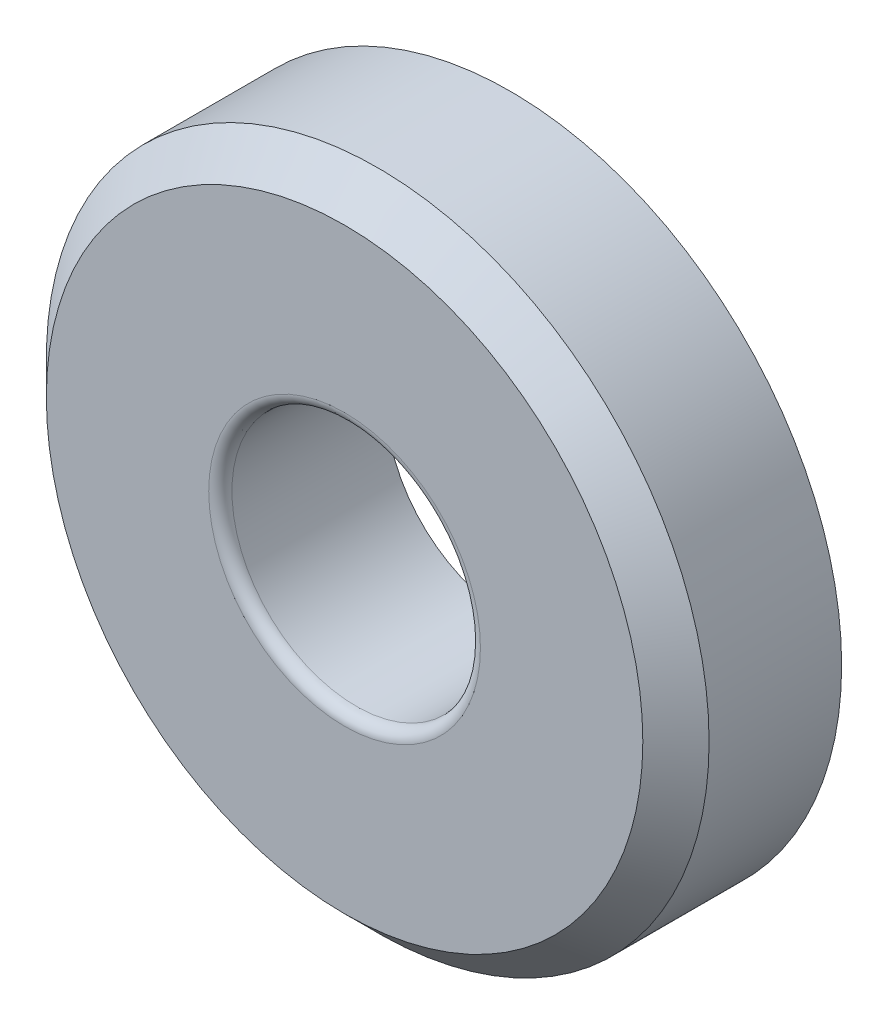
ISO-10303-21;
HEADER;
FILE_DESCRIPTION(('STEP AP214'),'2;1');
FILE_NAME('part.step','',(''),(''),'','','');
FILE_SCHEMA(('AUTOMOTIVE_DESIGN { 1 0 10303 214 1 1 1 1 }'));
ENDSEC;
DATA;
#1=APPLICATION_CONTEXT('core data for automotive mechanical design processes');
#2=APPLICATION_PROTOCOL_DEFINITION('international standard','automotive_design',2000,#1);
#3=PRODUCT_CONTEXT('',#1,'mechanical');
#4=PRODUCT('Part','Part','',(#3));
#5=PRODUCT_RELATED_PRODUCT_CATEGORY('part','',(#4));
#6=PRODUCT_DEFINITION_FORMATION('','',#4);
#7=PRODUCT_DEFINITION_CONTEXT('part definition',#1,'design');
#8=PRODUCT_DEFINITION('design','',#6,#7);
#9=PRODUCT_DEFINITION_SHAPE('','',#8);
#10=(LENGTH_UNIT() NAMED_UNIT(*) SI_UNIT(.MILLI.,.METRE.));
#11=(NAMED_UNIT(*) PLANE_ANGLE_UNIT() SI_UNIT($,.RADIAN.));
#12=(NAMED_UNIT(*) SI_UNIT($,.STERADIAN.) SOLID_ANGLE_UNIT());
#13=UNCERTAINTY_MEASURE_WITH_UNIT(LENGTH_MEASURE(1.E-05),#10,'distance_accuracy_value','');
#14=(GEOMETRIC_REPRESENTATION_CONTEXT(3) GLOBAL_UNCERTAINTY_ASSIGNED_CONTEXT((#13)) GLOBAL_UNIT_ASSIGNED_CONTEXT((#10,
#11,#12)) REPRESENTATION_CONTEXT('',''));
#15=CARTESIAN_POINT('',(0.,0.,0.));
#16=DIRECTION('',(0.,0.,1.));
#17=DIRECTION('',(1.,0.,0.));
#18=AXIS2_PLACEMENT_3D('',#15,#16,#17);
#19=CARTESIAN_POINT('',(0.,0.,12.7));
#20=DIRECTION('',(0.,0.,1.));
#21=DIRECTION('',(1.,0.,0.));
#22=AXIS2_PLACEMENT_3D('',#19,#20,#21);
#23=PLANE('',#22);
#24=CARTESIAN_POINT('',(0.,0.,12.7));
#25=DIRECTION('',(0.,0.,1.));
#26=DIRECTION('',(1.,0.,0.));
#27=AXIS2_PLACEMENT_3D('',#24,#25,#26);
#28=CIRCLE('',#27,10.414);
#29=CARTESIAN_POINT('',(10.414,0.,12.7));
#30=VERTEX_POINT('',#29);
#31=EDGE_CURVE('E10',#30,#30,#28,.F.);
#32=ORIENTED_EDGE('',*,*,#31,.T.);
#33=EDGE_LOOP('',(#32));
#34=FACE_BOUND('',#33,.T.);
#35=CARTESIAN_POINT('',(0.,0.,12.7));
#36=DIRECTION('',(0.,0.,1.));
#37=DIRECTION('',(1.,0.,0.));
#38=AXIS2_PLACEMENT_3D('',#35,#36,#37);
#39=CIRCLE('',#38,22.86);
#40=CARTESIAN_POINT('',(22.86,0.,12.7));
#41=VERTEX_POINT('',#40);
#42=EDGE_CURVE('E46',#41,#41,#39,.T.);
#43=ORIENTED_EDGE('',*,*,#42,.T.);
#44=EDGE_LOOP('',(#43));
#45=FACE_BOUND('',#44,.T.);
#46=ADVANCED_FACE('F31',(#34,#45),#23,.T.);
#47=CARTESIAN_POINT('',(0.,0.,0.));
#48=DIRECTION('',(0.,0.,1.));
#49=DIRECTION('',(1.,0.,0.));
#50=AXIS2_PLACEMENT_3D('',#47,#48,#49);
#51=PLANE('',#50);
#52=CARTESIAN_POINT('',(0.,0.,0.));
#53=DIRECTION('',(0.,0.,1.));
#54=DIRECTION('',(1.,0.,0.));
#55=AXIS2_PLACEMENT_3D('',#52,#53,#54);
#56=CIRCLE('',#55,25.4);
#57=CARTESIAN_POINT('',(25.4,0.,0.));
#58=VERTEX_POINT('',#57);
#59=EDGE_CURVE('E51',#58,#58,#56,.T.);
#60=ORIENTED_EDGE('',*,*,#59,.F.);
#61=EDGE_LOOP('',(#60));
#62=FACE_BOUND('',#61,.T.);
#63=CARTESIAN_POINT('',(0.,0.,0.));
#64=DIRECTION('',(0.,0.,1.));
#65=DIRECTION('',(1.,0.,0.));
#66=AXIS2_PLACEMENT_3D('',#63,#64,#65);
#67=CIRCLE('',#66,9.525);
#68=CARTESIAN_POINT('',(9.525,0.,0.));
#69=VERTEX_POINT('',#68);
#70=EDGE_CURVE('E54',#69,#69,#67,.T.);
#71=ORIENTED_EDGE('',*,*,#70,.T.);
#72=EDGE_LOOP('',(#71));
#73=FACE_BOUND('',#72,.T.);
#74=ADVANCED_FACE('F58',(#62,#73),#51,.F.);
#75=CARTESIAN_POINT('',(0.,0.,12.7));
#76=DIRECTION('',(0.,0.,-1.));
#77=DIRECTION('',(-1.,0.,0.));
#78=AXIS2_PLACEMENT_3D('',#75,#76,#77);
#79=CYLINDRICAL_SURFACE('',#78,25.4);
#80=CARTESIAN_POINT('',(0.,0.,10.16));
#81=DIRECTION('',(0.,0.,1.));
#82=DIRECTION('',(1.,0.,0.));
#83=AXIS2_PLACEMENT_3D('',#80,#81,#82);
#84=CIRCLE('',#83,25.4);
#85=CARTESIAN_POINT('',(25.4,0.,10.16));
#86=VERTEX_POINT('',#85);
#87=EDGE_CURVE('E42',#86,#86,#84,.F.);
#88=ORIENTED_EDGE('',*,*,#87,.T.);
#89=EDGE_LOOP('',(#88));
#90=FACE_BOUND('',#89,.T.);
#91=ORIENTED_EDGE('',*,*,#59,.T.);
#92=EDGE_LOOP('',(#91));
#93=FACE_BOUND('',#92,.T.);
#94=ADVANCED_FACE('F63',(#90,#93),#79,.T.);
#95=CARTESIAN_POINT('',(0.,0.,12.7));
#96=DIRECTION('',(0.,0.,-1.));
#97=DIRECTION('',(-1.,0.,0.));
#98=AXIS2_PLACEMENT_3D('',#95,#96,#97);
#99=CYLINDRICAL_SURFACE('',#98,9.525);
#100=CARTESIAN_POINT('',(0.,0.,11.811));
#101=DIRECTION('',(0.,0.,1.));
#102=DIRECTION('',(1.,0.,0.));
#103=AXIS2_PLACEMENT_3D('',#100,#101,#102);
#104=CIRCLE('',#103,9.525);
#105=CARTESIAN_POINT('',(9.525,0.,11.811));
#106=VERTEX_POINT('',#105);
#107=EDGE_CURVE('E38',#106,#106,#104,.T.);
#108=ORIENTED_EDGE('',*,*,#107,.T.);
#109=EDGE_LOOP('',(#108));
#110=FACE_BOUND('',#109,.T.);
#111=ORIENTED_EDGE('',*,*,#70,.F.);
#112=EDGE_LOOP('',(#111));
#113=FACE_BOUND('',#112,.T.);
#114=ADVANCED_FACE('F60',(#110,#113),#99,.F.);
#115=CARTESIAN_POINT('',(0.,0.,12.7));
#116=DIRECTION('',(0.,0.,-1.));
#117=DIRECTION('',(-1.,0.,0.));
#118=AXIS2_PLACEMENT_3D('',#115,#116,#117);
#119=CONICAL_SURFACE('',#118,22.86,0.785398163397446);
#120=ORIENTED_EDGE('',*,*,#87,.F.);
#121=EDGE_LOOP('',(#120));
#122=FACE_BOUND('',#121,.T.);
#123=ORIENTED_EDGE('',*,*,#42,.F.);
#124=EDGE_LOOP('',(#123));
#125=FACE_BOUND('',#124,.T.);
#126=ADVANCED_FACE('F62',(#122,#125),#119,.T.);
#127=CARTESIAN_POINT('',(0.,0.,11.811));
#128=DIRECTION('',(0.,0.,1.));
#129=DIRECTION('',(1.,0.,0.));
#130=AXIS2_PLACEMENT_3D('',#127,#128,#129);
#131=TOROIDAL_SURFACE('',#130,10.414,0.889);
#132=ORIENTED_EDGE('',*,*,#31,.F.);
#133=EDGE_LOOP('',(#132));
#134=FACE_BOUND('',#133,.T.);
#135=ORIENTED_EDGE('',*,*,#107,.F.);
#136=EDGE_LOOP('',(#135));
#137=FACE_BOUND('',#136,.T.);
#138=ADVANCED_FACE('F33',(#134,#137),#131,.T.);
#139=CLOSED_SHELL('',(#46,#74,#94,#114,#126,#138));
#140=MANIFOLD_SOLID_BREP('B2',#139);
#141=ADVANCED_BREP_SHAPE_REPRESENTATION('',(#18,#140),#14);
#142=SHAPE_DEFINITION_REPRESENTATION(#9,#141);
ENDSEC;
END-ISO-10303-21;
